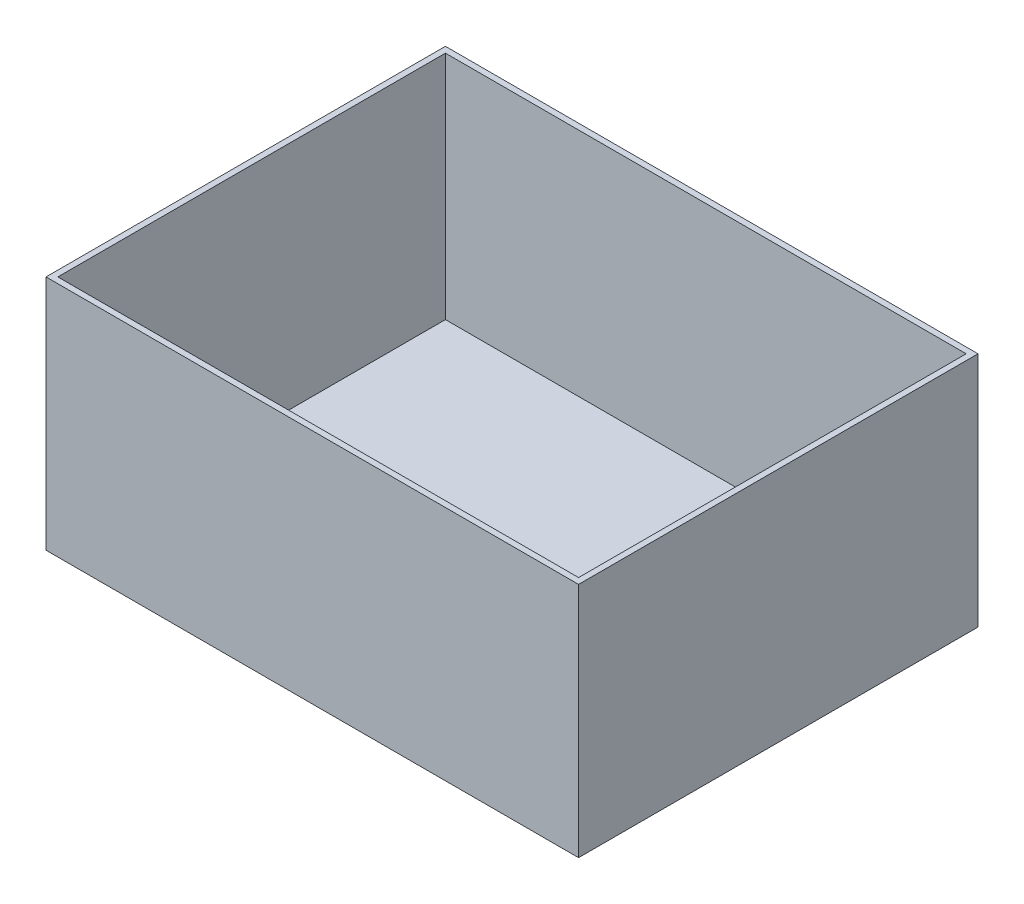
ISO-10303-21;
HEADER;
FILE_DESCRIPTION(('STEP AP214'),'2;1');
FILE_NAME('part.step','',(''),(''),'','','');
FILE_SCHEMA(('AUTOMOTIVE_DESIGN { 1 0 10303 214 1 1 1 1 }'));
ENDSEC;
DATA;
#1=APPLICATION_CONTEXT('core data for automotive mechanical design processes');
#2=APPLICATION_PROTOCOL_DEFINITION('international standard','automotive_design',2000,#1);
#3=PRODUCT_CONTEXT('',#1,'mechanical');
#4=PRODUCT('Part','Part','',(#3));
#5=PRODUCT_RELATED_PRODUCT_CATEGORY('part','',(#4));
#6=PRODUCT_DEFINITION_FORMATION('','',#4);
#7=PRODUCT_DEFINITION_CONTEXT('part definition',#1,'design');
#8=PRODUCT_DEFINITION('design','',#6,#7);
#9=PRODUCT_DEFINITION_SHAPE('','',#8);
#10=(LENGTH_UNIT() NAMED_UNIT(*) SI_UNIT(.MILLI.,.METRE.));
#11=(NAMED_UNIT(*) PLANE_ANGLE_UNIT() SI_UNIT($,.RADIAN.));
#12=(NAMED_UNIT(*) SI_UNIT($,.STERADIAN.) SOLID_ANGLE_UNIT());
#13=UNCERTAINTY_MEASURE_WITH_UNIT(LENGTH_MEASURE(1.E-05),#10,'distance_accuracy_value','');
#14=(GEOMETRIC_REPRESENTATION_CONTEXT(3) GLOBAL_UNCERTAINTY_ASSIGNED_CONTEXT((#13)) GLOBAL_UNIT_ASSIGNED_CONTEXT((#10,
#11,#12)) REPRESENTATION_CONTEXT('',''));
#15=CARTESIAN_POINT('',(0.,0.,0.));
#16=DIRECTION('',(0.,0.,1.));
#17=DIRECTION('',(1.,0.,0.));
#18=AXIS2_PLACEMENT_3D('',#15,#16,#17);
#19=CARTESIAN_POINT('',(0.,0.,675.));
#20=DIRECTION('',(0.,1.,0.));
#21=DIRECTION('',(-1.,0.,0.));
#22=AXIS2_PLACEMENT_3D('',#19,#20,#21);
#23=PLANE('',#22);
#24=DIRECTION('',(0.,0.,-1.));
#25=VECTOR('',#24,1.);
#26=CARTESIAN_POINT('',(-300.,0.,450.));
#27=LINE('',#26,#25);
#28=CARTESIAN_POINT('',(-300.,0.,450.));
#29=VERTEX_POINT('',#28);
#30=CARTESIAN_POINT('',(-300.,0.,440.));
#31=VERTEX_POINT('',#30);
#32=EDGE_CURVE('E167',#29,#31,#27,.T.);
#33=ORIENTED_EDGE('',*,*,#32,.F.);
#34=DIRECTION('',(-1.,0.,0.));
#35=VECTOR('',#34,1.);
#36=CARTESIAN_POINT('',(-300.,0.,450.));
#37=LINE('',#36,#35);
#38=CARTESIAN_POINT('',(-250.,0.,450.));
#39=VERTEX_POINT('',#38);
#40=EDGE_CURVE('E180',#39,#29,#37,.T.);
#41=ORIENTED_EDGE('',*,*,#40,.F.);
#42=DIRECTION('',(0.,0.,1.));
#43=VECTOR('',#42,1.);
#44=CARTESIAN_POINT('',(-250.,0.,450.));
#45=LINE('',#44,#43);
#46=CARTESIAN_POINT('',(-250.,0.,440.));
#47=VERTEX_POINT('',#46);
#48=EDGE_CURVE('E189',#47,#39,#45,.T.);
#49=ORIENTED_EDGE('',*,*,#48,.F.);
#50=DIRECTION('',(1.,0.,0.));
#51=VECTOR('',#50,1.);
#52=CARTESIAN_POINT('',(-300.,0.,440.));
#53=LINE('',#52,#51);
#54=EDGE_CURVE('E170',#31,#47,#53,.T.);
#55=ORIENTED_EDGE('',*,*,#54,.F.);
#56=EDGE_LOOP('',(#33,#41,#49,#55));
#57=FACE_BOUND('',#56,.T.);
#58=DIRECTION('',(1.,0.,0.));
#59=VECTOR('',#58,1.);
#60=CARTESIAN_POINT('',(0.,0.,0.));
#61=LINE('',#60,#59);
#62=CARTESIAN_POINT('',(-900.,-1.10218211923262E-13,0.));
#63=VERTEX_POINT('',#62);
#64=CARTESIAN_POINT('',(0.,0.,0.));
#65=VERTEX_POINT('',#64);
#66=EDGE_CURVE('E239',#63,#65,#61,.T.);
#67=ORIENTED_EDGE('',*,*,#66,.T.);
#68=DIRECTION('',(0.,0.,-1.));
#69=VECTOR('',#68,1.);
#70=CARTESIAN_POINT('',(0.,0.,675.));
#71=LINE('',#70,#69);
#72=CARTESIAN_POINT('',(0.,0.,675.));
#73=VERTEX_POINT('',#72);
#74=EDGE_CURVE('E245',#73,#65,#71,.T.);
#75=ORIENTED_EDGE('',*,*,#74,.F.);
#76=DIRECTION('',(1.,0.,0.));
#77=VECTOR('',#76,1.);
#78=CARTESIAN_POINT('',(0.,0.,675.));
#79=LINE('',#78,#77);
#80=CARTESIAN_POINT('',(-900.,-1.10218211923262E-13,675.));
#81=VERTEX_POINT('',#80);
#82=EDGE_CURVE('E243',#81,#73,#79,.T.);
#83=ORIENTED_EDGE('',*,*,#82,.F.);
#84=DIRECTION('',(0.,0.,-1.));
#85=VECTOR('',#84,1.);
#86=CARTESIAN_POINT('',(-900.,-1.10218211923262E-13,675.));
#87=LINE('',#86,#85);
#88=EDGE_CURVE('E255',#81,#63,#87,.T.);
#89=ORIENTED_EDGE('',*,*,#88,.T.);
#90=EDGE_LOOP('',(#67,#75,#83,#89));
#91=FACE_BOUND('',#90,.T.);
#92=DIRECTION('',(0.,0.,-1.));
#93=VECTOR('',#92,1.);
#94=CARTESIAN_POINT('',(-299.999999999999,0.,235.));
#95=LINE('',#94,#93);
#96=CARTESIAN_POINT('',(-299.999999999999,0.,235.));
#97=VERTEX_POINT('',#96);
#98=CARTESIAN_POINT('',(-299.999999999999,0.,225.));
#99=VERTEX_POINT('',#98);
#100=EDGE_CURVE('E166',#97,#99,#95,.T.);
#101=ORIENTED_EDGE('',*,*,#100,.F.);
#102=DIRECTION('',(-1.,0.,0.));
#103=VECTOR('',#102,1.);
#104=CARTESIAN_POINT('',(-299.999999999999,0.,235.));
#105=LINE('',#104,#103);
#106=CARTESIAN_POINT('',(-249.999999999999,0.,235.));
#107=VERTEX_POINT('',#106);
#108=EDGE_CURVE('E163',#107,#97,#105,.T.);
#109=ORIENTED_EDGE('',*,*,#108,.F.);
#110=DIRECTION('',(0.,0.,1.));
#111=VECTOR('',#110,1.);
#112=CARTESIAN_POINT('',(-249.999999999999,0.,235.));
#113=LINE('',#112,#111);
#114=CARTESIAN_POINT('',(-249.999999999999,0.,225.));
#115=VERTEX_POINT('',#114);
#116=EDGE_CURVE('E53',#115,#107,#113,.T.);
#117=ORIENTED_EDGE('',*,*,#116,.F.);
#118=DIRECTION('',(1.,0.,0.));
#119=VECTOR('',#118,1.);
#120=CARTESIAN_POINT('',(-299.999999999999,0.,225.));
#121=LINE('',#120,#119);
#122=EDGE_CURVE('E48',#99,#115,#121,.T.);
#123=ORIENTED_EDGE('',*,*,#122,.F.);
#124=EDGE_LOOP('',(#101,#109,#117,#123));
#125=FACE_BOUND('',#124,.T.);
#126=ADVANCED_FACE('F33',(#57,#91,#125),#23,.F.);
#127=CARTESIAN_POINT('',(0.,400.,675.));
#128=DIRECTION('',(0.,-1.,0.));
#129=DIRECTION('',(1.,0.,0.));
#130=AXIS2_PLACEMENT_3D('',#127,#128,#129);
#131=PLANE('',#130);
#132=DIRECTION('',(-1.,0.,0.));
#133=VECTOR('',#132,1.);
#134=CARTESIAN_POINT('',(0.,400.,0.));
#135=LINE('',#134,#133);
#136=CARTESIAN_POINT('',(0.,400.,0.));
#137=VERTEX_POINT('',#136);
#138=CARTESIAN_POINT('',(-900.,400.,0.));
#139=VERTEX_POINT('',#138);
#140=EDGE_CURVE('E248',#137,#139,#135,.T.);
#141=ORIENTED_EDGE('',*,*,#140,.T.);
#142=DIRECTION('',(0.,0.,-1.));
#143=VECTOR('',#142,1.);
#144=CARTESIAN_POINT('',(-900.,400.,675.));
#145=LINE('',#144,#143);
#146=CARTESIAN_POINT('',(-900.,400.,675.));
#147=VERTEX_POINT('',#146);
#148=EDGE_CURVE('E41',#147,#139,#145,.T.);
#149=ORIENTED_EDGE('',*,*,#148,.F.);
#150=DIRECTION('',(-1.,0.,0.));
#151=VECTOR('',#150,1.);
#152=CARTESIAN_POINT('',(0.,400.,675.));
#153=LINE('',#152,#151);
#154=CARTESIAN_POINT('',(0.,400.,675.));
#155=VERTEX_POINT('',#154);
#156=EDGE_CURVE('E238',#155,#147,#153,.T.);
#157=ORIENTED_EDGE('',*,*,#156,.F.);
#158=DIRECTION('',(0.,0.,-1.));
#159=VECTOR('',#158,1.);
#160=CARTESIAN_POINT('',(0.,400.,675.));
#161=LINE('',#160,#159);
#162=EDGE_CURVE('E11',#155,#137,#161,.T.);
#163=ORIENTED_EDGE('',*,*,#162,.T.);
#164=EDGE_LOOP('',(#141,#149,#157,#163));
#165=FACE_BOUND('',#164,.T.);
#166=DIRECTION('',(-1.,0.,0.));
#167=VECTOR('',#166,1.);
#168=CARTESIAN_POINT('',(0.,400.,10.));
#169=LINE('',#168,#167);
#170=CARTESIAN_POINT('',(-10.,400.,10.));
#171=VERTEX_POINT('',#170);
#172=CARTESIAN_POINT('',(-890.,400.,10.));
#173=VERTEX_POINT('',#172);
#174=EDGE_CURVE('E208',#171,#173,#169,.T.);
#175=ORIENTED_EDGE('',*,*,#174,.F.);
#176=DIRECTION('',(0.,0.,-1.));
#177=VECTOR('',#176,1.);
#178=CARTESIAN_POINT('',(-10.,400.,675.));
#179=LINE('',#178,#177);
#180=CARTESIAN_POINT('',(-10.,400.,665.));
#181=VERTEX_POINT('',#180);
#182=EDGE_CURVE('E227',#181,#171,#179,.T.);
#183=ORIENTED_EDGE('',*,*,#182,.F.);
#184=DIRECTION('',(-1.,0.,0.));
#185=VECTOR('',#184,1.);
#186=CARTESIAN_POINT('',(0.,400.,665.));
#187=LINE('',#186,#185);
#188=CARTESIAN_POINT('',(-890.,400.,665.));
#189=VERTEX_POINT('',#188);
#190=EDGE_CURVE('E211',#181,#189,#187,.T.);
#191=ORIENTED_EDGE('',*,*,#190,.T.);
#192=DIRECTION('',(0.,0.,-1.));
#193=VECTOR('',#192,1.);
#194=CARTESIAN_POINT('',(-890.,400.,675.));
#195=LINE('',#194,#193);
#196=EDGE_CURVE('E224',#189,#173,#195,.T.);
#197=ORIENTED_EDGE('',*,*,#196,.T.);
#198=EDGE_LOOP('',(#175,#183,#191,#197));
#199=FACE_BOUND('',#198,.T.);
#200=ADVANCED_FACE('F277',(#165,#199),#131,.F.);
#201=CARTESIAN_POINT('',(0.,0.,675.));
#202=DIRECTION('',(-1.,0.,0.));
#203=DIRECTION('',(0.,0.,1.));
#204=AXIS2_PLACEMENT_3D('',#201,#202,#203);
#205=PLANE('',#204);
#206=DIRECTION('',(0.,1.,0.));
#207=VECTOR('',#206,1.);
#208=CARTESIAN_POINT('',(0.,0.,0.));
#209=LINE('',#208,#207);
#210=EDGE_CURVE('E229',#65,#137,#209,.T.);
#211=ORIENTED_EDGE('',*,*,#210,.T.);
#212=ORIENTED_EDGE('',*,*,#162,.F.);
#213=DIRECTION('',(0.,1.,0.));
#214=VECTOR('',#213,1.);
#215=CARTESIAN_POINT('',(0.,0.,675.));
#216=LINE('',#215,#214);
#217=EDGE_CURVE('E235',#73,#155,#216,.T.);
#218=ORIENTED_EDGE('',*,*,#217,.F.);
#219=ORIENTED_EDGE('',*,*,#74,.T.);
#220=EDGE_LOOP('',(#211,#212,#218,#219));
#221=FACE_BOUND('',#220,.T.);
#222=ADVANCED_FACE('F35',(#221),#205,.F.);
#223=CARTESIAN_POINT('',(-900.,-1.10218211923262E-13,675.));
#224=DIRECTION('',(1.,0.,0.));
#225=DIRECTION('',(0.,0.,-1.));
#226=AXIS2_PLACEMENT_3D('',#223,#224,#225);
#227=PLANE('',#226);
#228=DIRECTION('',(0.,-1.,0.));
#229=VECTOR('',#228,1.);
#230=CARTESIAN_POINT('',(-900.,-1.10218211923262E-13,0.));
#231=LINE('',#230,#229);
#232=EDGE_CURVE('E250',#139,#63,#231,.T.);
#233=ORIENTED_EDGE('',*,*,#232,.T.);
#234=ORIENTED_EDGE('',*,*,#88,.F.);
#235=DIRECTION('',(0.,-1.,0.));
#236=VECTOR('',#235,1.);
#237=CARTESIAN_POINT('',(-900.,-1.10218211923262E-13,675.));
#238=LINE('',#237,#236);
#239=EDGE_CURVE('E241',#147,#81,#238,.T.);
#240=ORIENTED_EDGE('',*,*,#239,.F.);
#241=ORIENTED_EDGE('',*,*,#148,.T.);
#242=EDGE_LOOP('',(#233,#234,#240,#241));
#243=FACE_BOUND('',#242,.T.);
#244=ADVANCED_FACE('F262',(#243),#227,.F.);
#245=CARTESIAN_POINT('',(0.,0.,675.));
#246=DIRECTION('',(0.,0.,1.));
#247=DIRECTION('',(1.,0.,0.));
#248=AXIS2_PLACEMENT_3D('',#245,#246,#247);
#249=PLANE('',#248);
#250=ORIENTED_EDGE('',*,*,#217,.T.);
#251=ORIENTED_EDGE('',*,*,#156,.T.);
#252=ORIENTED_EDGE('',*,*,#239,.T.);
#253=ORIENTED_EDGE('',*,*,#82,.T.);
#254=EDGE_LOOP('',(#250,#251,#252,#253));
#255=FACE_BOUND('',#254,.T.);
#256=ADVANCED_FACE('F276',(#255),#249,.T.);
#257=CARTESIAN_POINT('',(0.,0.,0.));
#258=DIRECTION('',(0.,0.,1.));
#259=DIRECTION('',(1.,0.,0.));
#260=AXIS2_PLACEMENT_3D('',#257,#258,#259);
#261=PLANE('',#260);
#262=ORIENTED_EDGE('',*,*,#210,.F.);
#263=ORIENTED_EDGE('',*,*,#66,.F.);
#264=ORIENTED_EDGE('',*,*,#232,.F.);
#265=ORIENTED_EDGE('',*,*,#140,.F.);
#266=EDGE_LOOP('',(#262,#263,#264,#265));
#267=FACE_BOUND('',#266,.T.);
#268=ADVANCED_FACE('F268',(#267),#261,.F.);
#269=CARTESIAN_POINT('',(-10.,0.,675.));
#270=DIRECTION('',(-1.,0.,0.));
#271=DIRECTION('',(0.,0.,1.));
#272=AXIS2_PLACEMENT_3D('',#269,#270,#271);
#273=PLANE('',#272);
#274=DIRECTION('',(0.,1.,0.));
#275=VECTOR('',#274,1.);
#276=CARTESIAN_POINT('',(-10.,0.,10.));
#277=LINE('',#276,#275);
#278=CARTESIAN_POINT('',(-10.,10.,10.));
#279=VERTEX_POINT('',#278);
#280=EDGE_CURVE('E205',#279,#171,#277,.T.);
#281=ORIENTED_EDGE('',*,*,#280,.F.);
#282=DIRECTION('',(0.,0.,-1.));
#283=VECTOR('',#282,1.);
#284=CARTESIAN_POINT('',(-10.,10.,675.));
#285=LINE('',#284,#283);
#286=CARTESIAN_POINT('',(-10.,10.,665.));
#287=VERTEX_POINT('',#286);
#288=EDGE_CURVE('E213',#287,#279,#285,.T.);
#289=ORIENTED_EDGE('',*,*,#288,.F.);
#290=DIRECTION('',(0.,1.,0.));
#291=VECTOR('',#290,1.);
#292=CARTESIAN_POINT('',(-10.,0.,665.));
#293=LINE('',#292,#291);
#294=EDGE_CURVE('E209',#287,#181,#293,.T.);
#295=ORIENTED_EDGE('',*,*,#294,.T.);
#296=ORIENTED_EDGE('',*,*,#182,.T.);
#297=EDGE_LOOP('',(#281,#289,#295,#296));
#298=FACE_BOUND('',#297,.T.);
#299=ADVANCED_FACE('F297',(#298),#273,.T.);
#300=CARTESIAN_POINT('',(-890.,-1.10218211923262E-13,675.));
#301=DIRECTION('',(1.,0.,0.));
#302=DIRECTION('',(0.,0.,-1.));
#303=AXIS2_PLACEMENT_3D('',#300,#301,#302);
#304=PLANE('',#303);
#305=DIRECTION('',(0.,-1.,0.));
#306=VECTOR('',#305,1.);
#307=CARTESIAN_POINT('',(-890.,-1.10218211923262E-13,10.));
#308=LINE('',#307,#306);
#309=CARTESIAN_POINT('',(-890.,9.99999999999989,10.));
#310=VERTEX_POINT('',#309);
#311=EDGE_CURVE('E219',#173,#310,#308,.T.);
#312=ORIENTED_EDGE('',*,*,#311,.F.);
#313=ORIENTED_EDGE('',*,*,#196,.F.);
#314=DIRECTION('',(0.,-1.,0.));
#315=VECTOR('',#314,1.);
#316=CARTESIAN_POINT('',(-890.,-1.10218211923262E-13,665.));
#317=LINE('',#316,#315);
#318=CARTESIAN_POINT('',(-890.,9.99999999999989,665.));
#319=VERTEX_POINT('',#318);
#320=EDGE_CURVE('E221',#189,#319,#317,.T.);
#321=ORIENTED_EDGE('',*,*,#320,.T.);
#322=DIRECTION('',(0.,0.,-1.));
#323=VECTOR('',#322,1.);
#324=CARTESIAN_POINT('',(-890.,9.99999999999989,675.));
#325=LINE('',#324,#323);
#326=EDGE_CURVE('E216',#319,#310,#325,.T.);
#327=ORIENTED_EDGE('',*,*,#326,.T.);
#328=EDGE_LOOP('',(#312,#313,#321,#327));
#329=FACE_BOUND('',#328,.T.);
#330=ADVANCED_FACE('F287',(#329),#304,.T.);
#331=CARTESIAN_POINT('',(0.,10.,675.));
#332=DIRECTION('',(0.,1.,0.));
#333=DIRECTION('',(-1.,0.,0.));
#334=AXIS2_PLACEMENT_3D('',#331,#332,#333);
#335=PLANE('',#334);
#336=DIRECTION('',(1.,0.,0.));
#337=VECTOR('',#336,1.);
#338=CARTESIAN_POINT('',(0.,10.,10.));
#339=LINE('',#338,#337);
#340=EDGE_CURVE('E212',#310,#279,#339,.T.);
#341=ORIENTED_EDGE('',*,*,#340,.F.);
#342=ORIENTED_EDGE('',*,*,#326,.F.);
#343=DIRECTION('',(1.,0.,0.));
#344=VECTOR('',#343,1.);
#345=CARTESIAN_POINT('',(0.,10.,665.));
#346=LINE('',#345,#344);
#347=EDGE_CURVE('E217',#319,#287,#346,.T.);
#348=ORIENTED_EDGE('',*,*,#347,.T.);
#349=ORIENTED_EDGE('',*,*,#288,.T.);
#350=EDGE_LOOP('',(#341,#342,#348,#349));
#351=FACE_BOUND('',#350,.T.);
#352=ADVANCED_FACE('F293',(#351),#335,.T.);
#353=CARTESIAN_POINT('',(0.,0.,665.));
#354=DIRECTION('',(0.,0.,1.));
#355=DIRECTION('',(1.,0.,0.));
#356=AXIS2_PLACEMENT_3D('',#353,#354,#355);
#357=PLANE('',#356);
#358=ORIENTED_EDGE('',*,*,#294,.F.);
#359=ORIENTED_EDGE('',*,*,#347,.F.);
#360=ORIENTED_EDGE('',*,*,#320,.F.);
#361=ORIENTED_EDGE('',*,*,#190,.F.);
#362=EDGE_LOOP('',(#358,#359,#360,#361));
#363=FACE_BOUND('',#362,.T.);
#364=ADVANCED_FACE('F300',(#363),#357,.F.);
#365=CARTESIAN_POINT('',(0.,0.,10.));
#366=DIRECTION('',(0.,0.,1.));
#367=DIRECTION('',(1.,0.,0.));
#368=AXIS2_PLACEMENT_3D('',#365,#366,#367);
#369=PLANE('',#368);
#370=ORIENTED_EDGE('',*,*,#280,.T.);
#371=ORIENTED_EDGE('',*,*,#174,.T.);
#372=ORIENTED_EDGE('',*,*,#311,.T.);
#373=ORIENTED_EDGE('',*,*,#340,.T.);
#374=EDGE_LOOP('',(#370,#371,#372,#373));
#375=FACE_BOUND('',#374,.T.);
#376=ADVANCED_FACE('F284',(#375),#369,.T.);
#377=CARTESIAN_POINT('',(-300.,-50.,450.));
#378=DIRECTION('',(1.,0.,0.));
#379=DIRECTION('',(0.,1.,0.));
#380=AXIS2_PLACEMENT_3D('',#377,#378,#379);
#381=PLANE('',#380);
#382=ORIENTED_EDGE('',*,*,#32,.T.);
#383=DIRECTION('',(0.,1.,0.));
#384=VECTOR('',#383,1.);
#385=CARTESIAN_POINT('',(-300.,-50.,440.));
#386=LINE('',#385,#384);
#387=CARTESIAN_POINT('',(-300.,-50.,440.));
#388=VERTEX_POINT('',#387);
#389=EDGE_CURVE('E202',#388,#31,#386,.T.);
#390=ORIENTED_EDGE('',*,*,#389,.F.);
#391=DIRECTION('',(0.,0.,-1.));
#392=VECTOR('',#391,1.);
#393=CARTESIAN_POINT('',(-300.,-50.,450.));
#394=LINE('',#393,#392);
#395=CARTESIAN_POINT('',(-300.,-50.,450.));
#396=VERTEX_POINT('',#395);
#397=EDGE_CURVE('E176',#396,#388,#394,.T.);
#398=ORIENTED_EDGE('',*,*,#397,.F.);
#399=DIRECTION('',(0.,1.,0.));
#400=VECTOR('',#399,1.);
#401=CARTESIAN_POINT('',(-300.,-50.,450.));
#402=LINE('',#401,#400);
#403=EDGE_CURVE('E185',#396,#29,#402,.T.);
#404=ORIENTED_EDGE('',*,*,#403,.T.);
#405=EDGE_LOOP('',(#382,#390,#398,#404));
#406=FACE_BOUND('',#405,.T.);
#407=ADVANCED_FACE('F307',(#406),#381,.F.);
#408=CARTESIAN_POINT('',(-300.,-50.,440.));
#409=DIRECTION('',(0.,0.,1.));
#410=DIRECTION('',(1.,0.,0.));
#411=AXIS2_PLACEMENT_3D('',#408,#409,#410);
#412=PLANE('',#411);
#413=ORIENTED_EDGE('',*,*,#54,.T.);
#414=DIRECTION('',(0.,1.,0.));
#415=VECTOR('',#414,1.);
#416=CARTESIAN_POINT('',(-250.,-50.,440.));
#417=LINE('',#416,#415);
#418=CARTESIAN_POINT('',(-250.,-50.,440.));
#419=VERTEX_POINT('',#418);
#420=EDGE_CURVE('E199',#419,#47,#417,.T.);
#421=ORIENTED_EDGE('',*,*,#420,.F.);
#422=DIRECTION('',(1.,0.,0.));
#423=VECTOR('',#422,1.);
#424=CARTESIAN_POINT('',(-300.,-50.,440.));
#425=LINE('',#424,#423);
#426=EDGE_CURVE('E179',#388,#419,#425,.T.);
#427=ORIENTED_EDGE('',*,*,#426,.F.);
#428=ORIENTED_EDGE('',*,*,#389,.T.);
#429=EDGE_LOOP('',(#413,#421,#427,#428));
#430=FACE_BOUND('',#429,.T.);
#431=ADVANCED_FACE('F379',(#430),#412,.F.);
#432=CARTESIAN_POINT('',(-250.,-50.,450.));
#433=DIRECTION('',(-1.,0.,0.));
#434=DIRECTION('',(0.,-1.,0.));
#435=AXIS2_PLACEMENT_3D('',#432,#433,#434);
#436=PLANE('',#435);
#437=ORIENTED_EDGE('',*,*,#48,.T.);
#438=DIRECTION('',(0.,1.,0.));
#439=VECTOR('',#438,1.);
#440=CARTESIAN_POINT('',(-250.,-50.,450.));
#441=LINE('',#440,#439);
#442=CARTESIAN_POINT('',(-250.,-50.,450.));
#443=VERTEX_POINT('',#442);
#444=EDGE_CURVE('E196',#443,#39,#441,.T.);
#445=ORIENTED_EDGE('',*,*,#444,.F.);
#446=DIRECTION('',(0.,0.,1.));
#447=VECTOR('',#446,1.);
#448=CARTESIAN_POINT('',(-250.,-50.,450.));
#449=LINE('',#448,#447);
#450=EDGE_CURVE('E182',#419,#443,#449,.T.);
#451=ORIENTED_EDGE('',*,*,#450,.F.);
#452=ORIENTED_EDGE('',*,*,#420,.T.);
#453=EDGE_LOOP('',(#437,#445,#451,#452));
#454=FACE_BOUND('',#453,.T.);
#455=ADVANCED_FACE('F389',(#454),#436,.F.);
#456=CARTESIAN_POINT('',(-300.,-50.,450.));
#457=DIRECTION('',(0.,0.,-1.));
#458=DIRECTION('',(-1.,0.,0.));
#459=AXIS2_PLACEMENT_3D('',#456,#457,#458);
#460=PLANE('',#459);
#461=ORIENTED_EDGE('',*,*,#40,.T.);
#462=ORIENTED_EDGE('',*,*,#403,.F.);
#463=DIRECTION('',(-1.,0.,0.));
#464=VECTOR('',#463,1.);
#465=CARTESIAN_POINT('',(-300.,-50.,450.));
#466=LINE('',#465,#464);
#467=EDGE_CURVE('E184',#443,#396,#466,.T.);
#468=ORIENTED_EDGE('',*,*,#467,.F.);
#469=ORIENTED_EDGE('',*,*,#444,.T.);
#470=EDGE_LOOP('',(#461,#462,#468,#469));
#471=FACE_BOUND('',#470,.T.);
#472=ADVANCED_FACE('F399',(#471),#460,.F.);
#473=CARTESIAN_POINT('',(0.,-50.,0.));
#474=DIRECTION('',(0.,-1.,0.));
#475=DIRECTION('',(1.,0.,0.));
#476=AXIS2_PLACEMENT_3D('',#473,#474,#475);
#477=PLANE('',#476);
#478=ORIENTED_EDGE('',*,*,#397,.T.);
#479=ORIENTED_EDGE('',*,*,#426,.T.);
#480=ORIENTED_EDGE('',*,*,#450,.T.);
#481=ORIENTED_EDGE('',*,*,#467,.T.);
#482=EDGE_LOOP('',(#478,#479,#480,#481));
#483=FACE_BOUND('',#482,.T.);
#484=ADVANCED_FACE('F409',(#483),#477,.T.);
#485=CARTESIAN_POINT('',(-299.999999999999,-50.,235.));
#486=DIRECTION('',(1.,0.,0.));
#487=DIRECTION('',(0.,1.,0.));
#488=AXIS2_PLACEMENT_3D('',#485,#486,#487);
#489=PLANE('',#488);
#490=ORIENTED_EDGE('',*,*,#100,.T.);
#491=DIRECTION('',(0.,1.,0.));
#492=VECTOR('',#491,1.);
#493=CARTESIAN_POINT('',(-299.999999999999,-50.,225.));
#494=LINE('',#493,#492);
#495=CARTESIAN_POINT('',(-299.999999999999,-50.,225.));
#496=VERTEX_POINT('',#495);
#497=EDGE_CURVE('E147',#496,#99,#494,.T.);
#498=ORIENTED_EDGE('',*,*,#497,.F.);
#499=DIRECTION('',(0.,0.,-1.));
#500=VECTOR('',#499,1.);
#501=CARTESIAN_POINT('',(-299.999999999999,-50.,235.));
#502=LINE('',#501,#500);
#503=CARTESIAN_POINT('',(-299.999999999999,-50.,235.));
#504=VERTEX_POINT('',#503);
#505=EDGE_CURVE('E154',#504,#496,#502,.T.);
#506=ORIENTED_EDGE('',*,*,#505,.F.);
#507=DIRECTION('',(0.,1.,0.));
#508=VECTOR('',#507,1.);
#509=CARTESIAN_POINT('',(-299.999999999999,-50.,235.));
#510=LINE('',#509,#508);
#511=EDGE_CURVE('E469',#504,#97,#510,.T.);
#512=ORIENTED_EDGE('',*,*,#511,.T.);
#513=EDGE_LOOP('',(#490,#498,#506,#512));
#514=FACE_BOUND('',#513,.T.);
#515=ADVANCED_FACE('F165',(#514),#489,.F.);
#516=CARTESIAN_POINT('',(-299.999999999999,-50.,225.));
#517=DIRECTION('',(0.,0.,1.));
#518=DIRECTION('',(1.,0.,0.));
#519=AXIS2_PLACEMENT_3D('',#516,#517,#518);
#520=PLANE('',#519);
#521=ORIENTED_EDGE('',*,*,#122,.T.);
#522=DIRECTION('',(0.,1.,0.));
#523=VECTOR('',#522,1.);
#524=CARTESIAN_POINT('',(-249.999999999999,-50.,225.));
#525=LINE('',#524,#523);
#526=CARTESIAN_POINT('',(-249.999999999999,-50.,225.));
#527=VERTEX_POINT('',#526);
#528=EDGE_CURVE('E150',#527,#115,#525,.T.);
#529=ORIENTED_EDGE('',*,*,#528,.F.);
#530=DIRECTION('',(1.,0.,0.));
#531=VECTOR('',#530,1.);
#532=CARTESIAN_POINT('',(-299.999999999999,-50.,225.));
#533=LINE('',#532,#531);
#534=EDGE_CURVE('E143',#496,#527,#533,.T.);
#535=ORIENTED_EDGE('',*,*,#534,.F.);
#536=ORIENTED_EDGE('',*,*,#497,.T.);
#537=EDGE_LOOP('',(#521,#529,#535,#536));
#538=FACE_BOUND('',#537,.T.);
#539=ADVANCED_FACE('F145',(#538),#520,.F.);
#540=CARTESIAN_POINT('',(-249.999999999999,-50.,235.));
#541=DIRECTION('',(-1.,0.,0.));
#542=DIRECTION('',(0.,-1.,0.));
#543=AXIS2_PLACEMENT_3D('',#540,#541,#542);
#544=PLANE('',#543);
#545=ORIENTED_EDGE('',*,*,#116,.T.);
#546=DIRECTION('',(0.,1.,0.));
#547=VECTOR('',#546,1.);
#548=CARTESIAN_POINT('',(-249.999999999999,-50.,235.));
#549=LINE('',#548,#547);
#550=CARTESIAN_POINT('',(-249.999999999999,-50.,235.));
#551=VERTEX_POINT('',#550);
#552=EDGE_CURVE('E172',#551,#107,#549,.T.);
#553=ORIENTED_EDGE('',*,*,#552,.F.);
#554=DIRECTION('',(0.,0.,1.));
#555=VECTOR('',#554,1.);
#556=CARTESIAN_POINT('',(-249.999999999999,-50.,235.));
#557=LINE('',#556,#555);
#558=EDGE_CURVE('E153',#527,#551,#557,.T.);
#559=ORIENTED_EDGE('',*,*,#558,.F.);
#560=ORIENTED_EDGE('',*,*,#528,.T.);
#561=EDGE_LOOP('',(#545,#553,#559,#560));
#562=FACE_BOUND('',#561,.T.);
#563=ADVANCED_FACE('F436',(#562),#544,.F.);
#564=CARTESIAN_POINT('',(-299.999999999999,-50.,235.));
#565=DIRECTION('',(0.,0.,-1.));
#566=DIRECTION('',(-1.,0.,0.));
#567=AXIS2_PLACEMENT_3D('',#564,#565,#566);
#568=PLANE('',#567);
#569=ORIENTED_EDGE('',*,*,#108,.T.);
#570=ORIENTED_EDGE('',*,*,#511,.F.);
#571=DIRECTION('',(-1.,0.,0.));
#572=VECTOR('',#571,1.);
#573=CARTESIAN_POINT('',(-299.999999999999,-50.,235.));
#574=LINE('',#573,#572);
#575=EDGE_CURVE('E159',#551,#504,#574,.T.);
#576=ORIENTED_EDGE('',*,*,#575,.F.);
#577=ORIENTED_EDGE('',*,*,#552,.T.);
#578=EDGE_LOOP('',(#569,#570,#576,#577));
#579=FACE_BOUND('',#578,.T.);
#580=ADVANCED_FACE('F445',(#579),#568,.F.);
#581=CARTESIAN_POINT('',(0.,-50.,0.));
#582=DIRECTION('',(0.,-1.,0.));
#583=DIRECTION('',(1.,0.,0.));
#584=AXIS2_PLACEMENT_3D('',#581,#582,#583);
#585=PLANE('',#584);
#586=ORIENTED_EDGE('',*,*,#505,.T.);
#587=ORIENTED_EDGE('',*,*,#534,.T.);
#588=ORIENTED_EDGE('',*,*,#558,.T.);
#589=ORIENTED_EDGE('',*,*,#575,.T.);
#590=EDGE_LOOP('',(#586,#587,#588,#589));
#591=FACE_BOUND('',#590,.T.);
#592=ADVANCED_FACE('F157',(#591),#585,.T.);
#593=CLOSED_SHELL('',(#126,#200,#222,#244,#256,#268,#299,#330,#352,#364,#376,#407,#431,#455,
#472,#484,#515,#539,#563,#580,#592));
#594=MANIFOLD_SOLID_BREP('B2',#593);
#595=ADVANCED_BREP_SHAPE_REPRESENTATION('',(#18,#594),#14);
#596=SHAPE_DEFINITION_REPRESENTATION(#9,#595);
ENDSEC;
END-ISO-10303-21;
